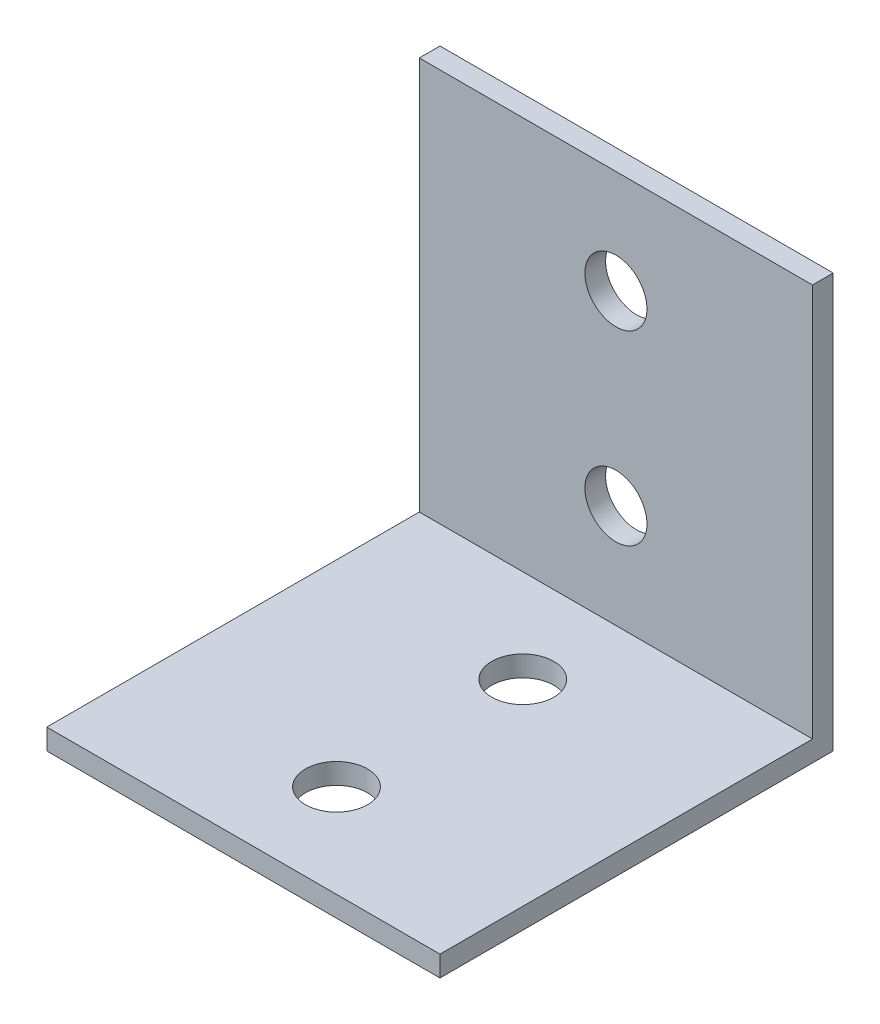
ISO-10303-21;
HEADER;
FILE_DESCRIPTION(('STEP AP214'),'2;1');
FILE_NAME('part.step','',(''),(''),'','','');
FILE_SCHEMA(('AUTOMOTIVE_DESIGN { 1 0 10303 214 1 1 1 1 }'));
ENDSEC;
DATA;
#1=APPLICATION_CONTEXT('core data for automotive mechanical design processes');
#2=APPLICATION_PROTOCOL_DEFINITION('international standard','automotive_design',2000,#1);
#3=PRODUCT_CONTEXT('',#1,'mechanical');
#4=PRODUCT('Part','Part','',(#3));
#5=PRODUCT_RELATED_PRODUCT_CATEGORY('part','',(#4));
#6=PRODUCT_DEFINITION_FORMATION('','',#4);
#7=PRODUCT_DEFINITION_CONTEXT('part definition',#1,'design');
#8=PRODUCT_DEFINITION('design','',#6,#7);
#9=PRODUCT_DEFINITION_SHAPE('','',#8);
#10=(LENGTH_UNIT() NAMED_UNIT(*) SI_UNIT(.MILLI.,.METRE.));
#11=(NAMED_UNIT(*) PLANE_ANGLE_UNIT() SI_UNIT($,.RADIAN.));
#12=(NAMED_UNIT(*) SI_UNIT($,.STERADIAN.) SOLID_ANGLE_UNIT());
#13=UNCERTAINTY_MEASURE_WITH_UNIT(LENGTH_MEASURE(1.E-05),#10,'distance_accuracy_value','');
#14=(GEOMETRIC_REPRESENTATION_CONTEXT(3) GLOBAL_UNCERTAINTY_ASSIGNED_CONTEXT((#13)) GLOBAL_UNIT_ASSIGNED_CONTEXT((#10,
#11,#12)) REPRESENTATION_CONTEXT('',''));
#15=CARTESIAN_POINT('',(0.,0.,0.));
#16=DIRECTION('',(0.,0.,1.));
#17=DIRECTION('',(1.,0.,0.));
#18=AXIS2_PLACEMENT_3D('',#15,#16,#17);
#19=CARTESIAN_POINT('',(-32.0816506224834,2.,-34.7382352941177));
#20=DIRECTION('',(1.,0.,0.));
#21=DIRECTION('',(0.,0.,-1.));
#22=AXIS2_PLACEMENT_3D('',#19,#20,#21);
#23=PLANE('',#22);
#24=DIRECTION('',(0.,0.,1.));
#25=VECTOR('',#24,1.);
#26=CARTESIAN_POINT('',(-32.0816506224834,0.,-34.7382352941177));
#27=LINE('',#26,#25);
#28=CARTESIAN_POINT('',(-32.0816506224834,0.,-34.7382352941177));
#29=VERTEX_POINT('',#28);
#30=CARTESIAN_POINT('',(-32.0816506224834,0.,3.26176470588235));
#31=VERTEX_POINT('',#30);
#32=EDGE_CURVE('E101',#29,#31,#27,.T.);
#33=ORIENTED_EDGE('',*,*,#32,.T.);
#34=DIRECTION('',(0.,-1.,0.));
#35=VECTOR('',#34,1.);
#36=CARTESIAN_POINT('',(-32.0816506224834,2.,3.26176470588235));
#37=LINE('',#36,#35);
#38=CARTESIAN_POINT('',(-32.0816506224834,2.,3.26176470588235));
#39=VERTEX_POINT('',#38);
#40=EDGE_CURVE('E11',#39,#31,#37,.T.);
#41=ORIENTED_EDGE('',*,*,#40,.F.);
#42=DIRECTION('',(0.,0.,1.));
#43=VECTOR('',#42,1.);
#44=CARTESIAN_POINT('',(-32.0816506224834,2.,-34.7382352941177));
#45=LINE('',#44,#43);
#46=CARTESIAN_POINT('',(-32.0816506224834,2.,-32.7382352941177));
#47=VERTEX_POINT('',#46);
#48=EDGE_CURVE('E94',#47,#39,#45,.T.);
#49=ORIENTED_EDGE('',*,*,#48,.F.);
#50=DIRECTION('',(0.,-1.,0.));
#51=VECTOR('',#50,1.);
#52=CARTESIAN_POINT('',(-32.0816506224834,40.,-32.7382352941177));
#53=LINE('',#52,#51);
#54=CARTESIAN_POINT('',(-32.0816506224834,40.,-32.7382352941177));
#55=VERTEX_POINT('',#54);
#56=EDGE_CURVE('E111',#55,#47,#53,.T.);
#57=ORIENTED_EDGE('',*,*,#56,.F.);
#58=DIRECTION('',(0.,0.,1.));
#59=VECTOR('',#58,1.);
#60=CARTESIAN_POINT('',(-32.0816506224834,40.,-34.7382352941177));
#61=LINE('',#60,#59);
#62=CARTESIAN_POINT('',(-32.0816506224834,40.,-34.7382352941177));
#63=VERTEX_POINT('',#62);
#64=EDGE_CURVE('E104',#63,#55,#61,.T.);
#65=ORIENTED_EDGE('',*,*,#64,.F.);
#66=DIRECTION('',(0.,-1.,0.));
#67=VECTOR('',#66,1.);
#68=CARTESIAN_POINT('',(-32.0816506224834,2.,-34.7382352941177));
#69=LINE('',#68,#67);
#70=EDGE_CURVE('E86',#63,#29,#69,.T.);
#71=ORIENTED_EDGE('',*,*,#70,.T.);
#72=EDGE_LOOP('',(#33,#41,#49,#57,#65,#71));
#73=FACE_BOUND('',#72,.T.);
#74=ADVANCED_FACE('F39',(#73),#23,.F.);
#75=CARTESIAN_POINT('',(-32.0816506224834,2.,3.26176470588235));
#76=DIRECTION('',(0.,0.,-1.));
#77=DIRECTION('',(-1.,0.,0.));
#78=AXIS2_PLACEMENT_3D('',#75,#76,#77);
#79=PLANE('',#78);
#80=DIRECTION('',(1.,0.,0.));
#81=VECTOR('',#80,1.);
#82=CARTESIAN_POINT('',(-32.0816506224834,0.,3.26176470588235));
#83=LINE('',#82,#81);
#84=CARTESIAN_POINT('',(5.91834937751656,0.,3.26176470588235));
#85=VERTEX_POINT('',#84);
#86=EDGE_CURVE('E109',#31,#85,#83,.T.);
#87=ORIENTED_EDGE('',*,*,#86,.T.);
#88=DIRECTION('',(0.,-1.,0.));
#89=VECTOR('',#88,1.);
#90=CARTESIAN_POINT('',(5.91834937751656,2.,3.26176470588235));
#91=LINE('',#90,#89);
#92=CARTESIAN_POINT('',(5.91834937751656,2.,3.26176470588235));
#93=VERTEX_POINT('',#92);
#94=EDGE_CURVE('E48',#93,#85,#91,.T.);
#95=ORIENTED_EDGE('',*,*,#94,.F.);
#96=DIRECTION('',(1.,0.,0.));
#97=VECTOR('',#96,1.);
#98=CARTESIAN_POINT('',(-32.0816506224834,2.,3.26176470588235));
#99=LINE('',#98,#97);
#100=EDGE_CURVE('E62',#39,#93,#99,.T.);
#101=ORIENTED_EDGE('',*,*,#100,.F.);
#102=ORIENTED_EDGE('',*,*,#40,.T.);
#103=EDGE_LOOP('',(#87,#95,#101,#102));
#104=FACE_BOUND('',#103,.T.);
#105=ADVANCED_FACE('F203',(#104),#79,.F.);
#106=CARTESIAN_POINT('',(5.91834937751656,2.,-34.7382352941177));
#107=DIRECTION('',(-1.,0.,0.));
#108=DIRECTION('',(0.,0.,1.));
#109=AXIS2_PLACEMENT_3D('',#106,#107,#108);
#110=PLANE('',#109);
#111=DIRECTION('',(0.,0.,-1.));
#112=VECTOR('',#111,1.);
#113=CARTESIAN_POINT('',(5.91834937751656,0.,-34.7382352941177));
#114=LINE('',#113,#112);
#115=CARTESIAN_POINT('',(5.91834937751656,0.,-34.7382352941177));
#116=VERTEX_POINT('',#115);
#117=EDGE_CURVE('E95',#85,#116,#114,.T.);
#118=ORIENTED_EDGE('',*,*,#117,.T.);
#119=DIRECTION('',(0.,-1.,0.));
#120=VECTOR('',#119,1.);
#121=CARTESIAN_POINT('',(5.91834937751656,2.,-34.7382352941177));
#122=LINE('',#121,#120);
#123=CARTESIAN_POINT('',(5.91834937751656,40.,-34.7382352941177));
#124=VERTEX_POINT('',#123);
#125=EDGE_CURVE('E89',#124,#116,#122,.T.);
#126=ORIENTED_EDGE('',*,*,#125,.F.);
#127=DIRECTION('',(0.,0.,-1.));
#128=VECTOR('',#127,1.);
#129=CARTESIAN_POINT('',(5.91834937751656,40.,-34.7382352941177));
#130=LINE('',#129,#128);
#131=CARTESIAN_POINT('',(5.91834937751656,40.,-32.7382352941177));
#132=VERTEX_POINT('',#131);
#133=EDGE_CURVE('E168',#132,#124,#130,.T.);
#134=ORIENTED_EDGE('',*,*,#133,.F.);
#135=DIRECTION('',(0.,-1.,0.));
#136=VECTOR('',#135,1.);
#137=CARTESIAN_POINT('',(5.91834937751656,40.,-32.7382352941177));
#138=LINE('',#137,#136);
#139=CARTESIAN_POINT('',(5.91834937751656,2.,-32.7382352941177));
#140=VERTEX_POINT('',#139);
#141=EDGE_CURVE('E117',#132,#140,#138,.T.);
#142=ORIENTED_EDGE('',*,*,#141,.T.);
#143=DIRECTION('',(0.,0.,-1.));
#144=VECTOR('',#143,1.);
#145=CARTESIAN_POINT('',(5.91834937751656,2.,-34.7382352941177));
#146=LINE('',#145,#144);
#147=EDGE_CURVE('E106',#93,#140,#146,.T.);
#148=ORIENTED_EDGE('',*,*,#147,.F.);
#149=ORIENTED_EDGE('',*,*,#94,.T.);
#150=EDGE_LOOP('',(#118,#126,#134,#142,#148,#149));
#151=FACE_BOUND('',#150,.T.);
#152=ADVANCED_FACE('F194',(#151),#110,.F.);
#153=CARTESIAN_POINT('',(-32.0816506224834,2.,-34.7382352941177));
#154=DIRECTION('',(0.,0.,1.));
#155=DIRECTION('',(1.,0.,0.));
#156=AXIS2_PLACEMENT_3D('',#153,#154,#155);
#157=PLANE('',#156);
#158=CARTESIAN_POINT('',(-13.0816506224834,30.,-34.7382352941177));
#159=DIRECTION('',(0.,0.,1.));
#160=DIRECTION('',(1.,0.,0.));
#161=AXIS2_PLACEMENT_3D('',#158,#159,#160);
#162=CIRCLE('',#161,3.);
#163=CARTESIAN_POINT('',(-10.0816506224834,30.,-34.7382352941177));
#164=VERTEX_POINT('',#163);
#165=EDGE_CURVE('E158',#164,#164,#162,.T.);
#166=ORIENTED_EDGE('',*,*,#165,.T.);
#167=EDGE_LOOP('',(#166));
#168=FACE_BOUND('',#167,.T.);
#169=CARTESIAN_POINT('',(-13.0816506224834,12.,-34.7382352941177));
#170=DIRECTION('',(0.,0.,1.));
#171=DIRECTION('',(1.,0.,0.));
#172=AXIS2_PLACEMENT_3D('',#169,#170,#171);
#173=CIRCLE('',#172,3.);
#174=CARTESIAN_POINT('',(-10.0816506224834,12.,-34.7382352941177));
#175=VERTEX_POINT('',#174);
#176=EDGE_CURVE('E151',#175,#175,#173,.T.);
#177=ORIENTED_EDGE('',*,*,#176,.T.);
#178=EDGE_LOOP('',(#177));
#179=FACE_BOUND('',#178,.T.);
#180=DIRECTION('',(-1.,0.,0.));
#181=VECTOR('',#180,1.);
#182=CARTESIAN_POINT('',(-32.0816506224834,0.,-34.7382352941177));
#183=LINE('',#182,#181);
#184=EDGE_CURVE('E82',#116,#29,#183,.T.);
#185=ORIENTED_EDGE('',*,*,#184,.T.);
#186=ORIENTED_EDGE('',*,*,#70,.F.);
#187=DIRECTION('',(-1.,0.,0.));
#188=VECTOR('',#187,1.);
#189=CARTESIAN_POINT('',(-32.0816506224834,40.,-34.7382352941177));
#190=LINE('',#189,#188);
#191=EDGE_CURVE('E172',#124,#63,#190,.T.);
#192=ORIENTED_EDGE('',*,*,#191,.F.);
#193=ORIENTED_EDGE('',*,*,#125,.T.);
#194=EDGE_LOOP('',(#185,#186,#192,#193));
#195=FACE_BOUND('',#194,.T.);
#196=ADVANCED_FACE('F84',(#168,#179,#195),#157,.F.);
#197=CARTESIAN_POINT('',(0.,2.,0.));
#198=DIRECTION('',(0.,1.,0.));
#199=DIRECTION('',(0.,0.,1.));
#200=AXIS2_PLACEMENT_3D('',#197,#198,#199);
#201=PLANE('',#200);
#202=CARTESIAN_POINT('',(-13.0816506224834,2.,-5.73823529411765));
#203=DIRECTION('',(0.,1.,0.));
#204=DIRECTION('',(0.,0.,1.));
#205=AXIS2_PLACEMENT_3D('',#202,#203,#204);
#206=CIRCLE('',#205,3.);
#207=CARTESIAN_POINT('',(-13.0816506224834,2.,-2.73823529411765));
#208=VERTEX_POINT('',#207);
#209=EDGE_CURVE('E131',#208,#208,#206,.T.);
#210=ORIENTED_EDGE('',*,*,#209,.F.);
#211=EDGE_LOOP('',(#210));
#212=FACE_BOUND('',#211,.T.);
#213=CARTESIAN_POINT('',(-13.0816506224834,2.,-23.7382352941177));
#214=DIRECTION('',(0.,1.,0.));
#215=DIRECTION('',(0.,0.,-1.));
#216=AXIS2_PLACEMENT_3D('',#213,#214,#215);
#217=CIRCLE('',#216,3.);
#218=CARTESIAN_POINT('',(-13.0816506224834,2.,-26.7382352941177));
#219=VERTEX_POINT('',#218);
#220=EDGE_CURVE('E139',#219,#219,#217,.T.);
#221=ORIENTED_EDGE('',*,*,#220,.F.);
#222=EDGE_LOOP('',(#221));
#223=FACE_BOUND('',#222,.T.);
#224=DIRECTION('',(1.,0.,0.));
#225=VECTOR('',#224,1.);
#226=CARTESIAN_POINT('',(-32.0816506224834,2.,-32.7382352941177));
#227=LINE('',#226,#225);
#228=EDGE_CURVE('E56',#47,#140,#227,.T.);
#229=ORIENTED_EDGE('',*,*,#228,.F.);
#230=ORIENTED_EDGE('',*,*,#48,.T.);
#231=ORIENTED_EDGE('',*,*,#100,.T.);
#232=ORIENTED_EDGE('',*,*,#147,.T.);
#233=EDGE_LOOP('',(#229,#230,#231,#232));
#234=FACE_BOUND('',#233,.T.);
#235=ADVANCED_FACE('F185',(#212,#223,#234),#201,.T.);
#236=CARTESIAN_POINT('',(0.,0.,0.));
#237=DIRECTION('',(0.,1.,0.));
#238=DIRECTION('',(0.,0.,1.));
#239=AXIS2_PLACEMENT_3D('',#236,#237,#238);
#240=PLANE('',#239);
#241=CARTESIAN_POINT('',(-13.0816506224834,0.,-5.73823529411765));
#242=DIRECTION('',(0.,1.,0.));
#243=DIRECTION('',(0.,0.,1.));
#244=AXIS2_PLACEMENT_3D('',#241,#242,#243);
#245=CIRCLE('',#244,3.);
#246=CARTESIAN_POINT('',(-13.0816506224834,0.,-2.73823529411765));
#247=VERTEX_POINT('',#246);
#248=EDGE_CURVE('E42',#247,#247,#245,.T.);
#249=ORIENTED_EDGE('',*,*,#248,.T.);
#250=EDGE_LOOP('',(#249));
#251=FACE_BOUND('',#250,.T.);
#252=CARTESIAN_POINT('',(-13.0816506224834,0.,-23.7382352941177));
#253=DIRECTION('',(0.,1.,0.));
#254=DIRECTION('',(0.,0.,1.));
#255=AXIS2_PLACEMENT_3D('',#252,#253,#254);
#256=CIRCLE('',#255,3.);
#257=CARTESIAN_POINT('',(-13.0816506224834,0.,-20.7382352941176));
#258=VERTEX_POINT('',#257);
#259=EDGE_CURVE('E128',#258,#258,#256,.T.);
#260=ORIENTED_EDGE('',*,*,#259,.T.);
#261=EDGE_LOOP('',(#260));
#262=FACE_BOUND('',#261,.T.);
#263=ORIENTED_EDGE('',*,*,#32,.F.);
#264=ORIENTED_EDGE('',*,*,#184,.F.);
#265=ORIENTED_EDGE('',*,*,#117,.F.);
#266=ORIENTED_EDGE('',*,*,#86,.F.);
#267=EDGE_LOOP('',(#263,#264,#265,#266));
#268=FACE_BOUND('',#267,.T.);
#269=ADVANCED_FACE('F108',(#251,#262,#268),#240,.F.);
#270=CARTESIAN_POINT('',(-32.0816506224834,40.,-32.7382352941177));
#271=DIRECTION('',(0.,0.,-1.));
#272=DIRECTION('',(-1.,0.,0.));
#273=AXIS2_PLACEMENT_3D('',#270,#271,#272);
#274=PLANE('',#273);
#275=CARTESIAN_POINT('',(-13.0816506224834,30.,-32.7382352941177));
#276=DIRECTION('',(0.,0.,1.));
#277=DIRECTION('',(1.,0.,0.));
#278=AXIS2_PLACEMENT_3D('',#275,#276,#277);
#279=CIRCLE('',#278,3.);
#280=CARTESIAN_POINT('',(-10.0816506224834,30.,-32.7382352941177));
#281=VERTEX_POINT('',#280);
#282=EDGE_CURVE('E147',#281,#281,#279,.T.);
#283=ORIENTED_EDGE('',*,*,#282,.F.);
#284=EDGE_LOOP('',(#283));
#285=FACE_BOUND('',#284,.T.);
#286=CARTESIAN_POINT('',(-13.0816506224834,12.,-32.7382352941177));
#287=DIRECTION('',(0.,0.,1.));
#288=DIRECTION('',(-1.,0.,0.));
#289=AXIS2_PLACEMENT_3D('',#286,#287,#288);
#290=CIRCLE('',#289,3.);
#291=CARTESIAN_POINT('',(-16.0816506224834,12.,-32.7382352941177));
#292=VERTEX_POINT('',#291);
#293=EDGE_CURVE('E137',#292,#292,#290,.T.);
#294=ORIENTED_EDGE('',*,*,#293,.F.);
#295=EDGE_LOOP('',(#294));
#296=FACE_BOUND('',#295,.T.);
#297=ORIENTED_EDGE('',*,*,#228,.T.);
#298=ORIENTED_EDGE('',*,*,#141,.F.);
#299=DIRECTION('',(1.,0.,0.));
#300=VECTOR('',#299,1.);
#301=CARTESIAN_POINT('',(-32.0816506224834,40.,-32.7382352941177));
#302=LINE('',#301,#300);
#303=EDGE_CURVE('E164',#55,#132,#302,.T.);
#304=ORIENTED_EDGE('',*,*,#303,.F.);
#305=ORIENTED_EDGE('',*,*,#56,.T.);
#306=EDGE_LOOP('',(#297,#298,#304,#305));
#307=FACE_BOUND('',#306,.T.);
#308=ADVANCED_FACE('F190',(#285,#296,#307),#274,.F.);
#309=CARTESIAN_POINT('',(0.,40.,0.));
#310=DIRECTION('',(0.,1.,0.));
#311=DIRECTION('',(0.,0.,1.));
#312=AXIS2_PLACEMENT_3D('',#309,#310,#311);
#313=PLANE('',#312);
#314=ORIENTED_EDGE('',*,*,#64,.T.);
#315=ORIENTED_EDGE('',*,*,#303,.T.);
#316=ORIENTED_EDGE('',*,*,#133,.T.);
#317=ORIENTED_EDGE('',*,*,#191,.T.);
#318=EDGE_LOOP('',(#314,#315,#316,#317));
#319=FACE_BOUND('',#318,.T.);
#320=ADVANCED_FACE('F198',(#319),#313,.T.);
#321=CARTESIAN_POINT('',(-13.0816506224834,12.,-42.7382352941177));
#322=DIRECTION('',(0.,0.,1.));
#323=DIRECTION('',(1.,0.,0.));
#324=AXIS2_PLACEMENT_3D('',#321,#322,#323);
#325=CYLINDRICAL_SURFACE('',#324,3.);
#326=ORIENTED_EDGE('',*,*,#293,.T.);
#327=EDGE_LOOP('',(#326));
#328=FACE_BOUND('',#327,.T.);
#329=ORIENTED_EDGE('',*,*,#176,.F.);
#330=EDGE_LOOP('',(#329));
#331=FACE_BOUND('',#330,.T.);
#332=ADVANCED_FACE('F225',(#328,#331),#325,.F.);
#333=CARTESIAN_POINT('',(-13.0816506224834,30.,-42.7382352941177));
#334=DIRECTION('',(0.,0.,1.));
#335=DIRECTION('',(1.,0.,0.));
#336=AXIS2_PLACEMENT_3D('',#333,#334,#335);
#337=CYLINDRICAL_SURFACE('',#336,3.);
#338=ORIENTED_EDGE('',*,*,#282,.T.);
#339=EDGE_LOOP('',(#338));
#340=FACE_BOUND('',#339,.T.);
#341=ORIENTED_EDGE('',*,*,#165,.F.);
#342=EDGE_LOOP('',(#341));
#343=FACE_BOUND('',#342,.T.);
#344=ADVANCED_FACE('F228',(#340,#343),#337,.F.);
#345=CARTESIAN_POINT('',(-13.0816506224834,-8.,-23.7382352941177));
#346=DIRECTION('',(0.,1.,0.));
#347=DIRECTION('',(0.,0.,1.));
#348=AXIS2_PLACEMENT_3D('',#345,#346,#347);
#349=CYLINDRICAL_SURFACE('',#348,3.);
#350=ORIENTED_EDGE('',*,*,#220,.T.);
#351=EDGE_LOOP('',(#350));
#352=FACE_BOUND('',#351,.T.);
#353=ORIENTED_EDGE('',*,*,#259,.F.);
#354=EDGE_LOOP('',(#353));
#355=FACE_BOUND('',#354,.T.);
#356=ADVANCED_FACE('F232',(#352,#355),#349,.F.);
#357=CARTESIAN_POINT('',(-13.0816506224834,-8.,-5.73823529411765));
#358=DIRECTION('',(0.,1.,0.));
#359=DIRECTION('',(0.,0.,1.));
#360=AXIS2_PLACEMENT_3D('',#357,#358,#359);
#361=CYLINDRICAL_SURFACE('',#360,3.);
#362=ORIENTED_EDGE('',*,*,#209,.T.);
#363=EDGE_LOOP('',(#362));
#364=FACE_BOUND('',#363,.T.);
#365=ORIENTED_EDGE('',*,*,#248,.F.);
#366=EDGE_LOOP('',(#365));
#367=FACE_BOUND('',#366,.T.);
#368=ADVANCED_FACE('F236',(#364,#367),#361,.F.);
#369=CLOSED_SHELL('',(#74,#105,#152,#196,#235,#269,#308,#320,#332,#344,#356,#368));
#370=MANIFOLD_SOLID_BREP('B2',#369);
#371=ADVANCED_BREP_SHAPE_REPRESENTATION('',(#18,#370),#14);
#372=SHAPE_DEFINITION_REPRESENTATION(#9,#371);
ENDSEC;
END-ISO-10303-21;
